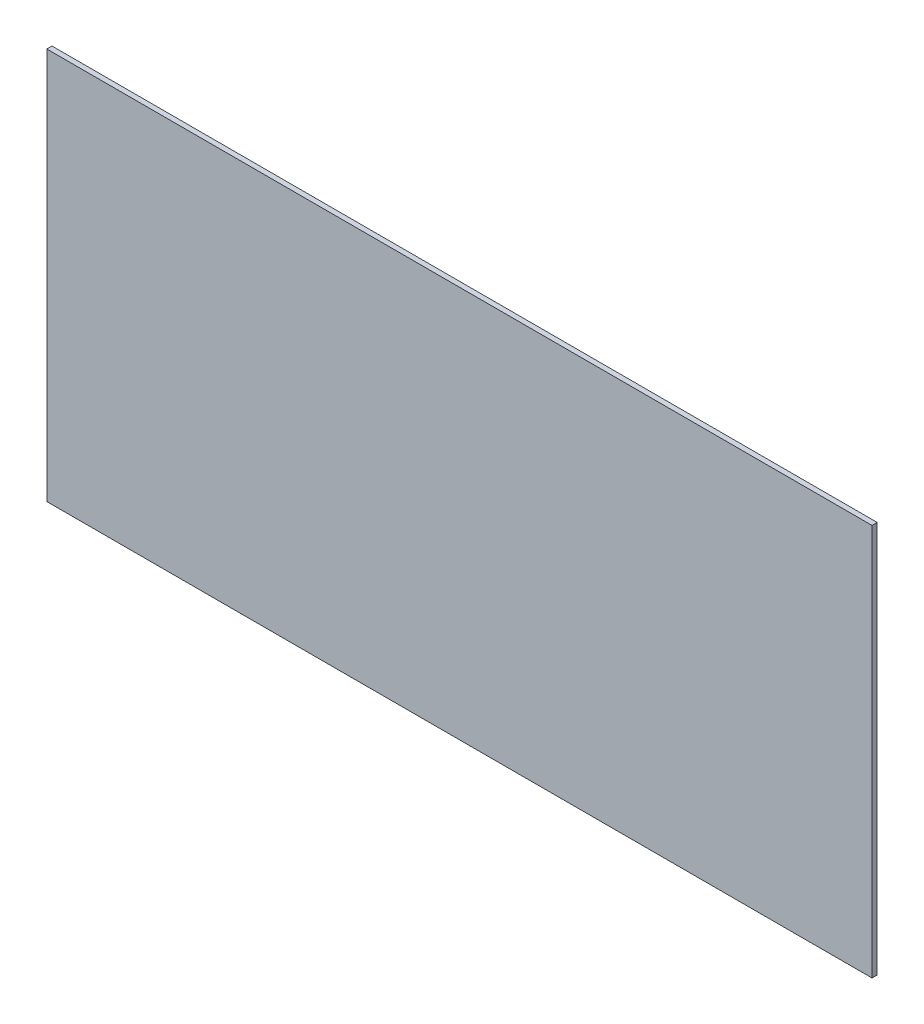
ISO-10303-21;
HEADER;
FILE_DESCRIPTION(('STEP AP214'),'2;1');
FILE_NAME('part.step','',(''),(''),'','','');
FILE_SCHEMA(('AUTOMOTIVE_DESIGN { 1 0 10303 214 1 1 1 1 }'));
ENDSEC;
DATA;
#1=APPLICATION_CONTEXT('core data for automotive mechanical design processes');
#2=APPLICATION_PROTOCOL_DEFINITION('international standard','automotive_design',2000,#1);
#3=PRODUCT_CONTEXT('',#1,'mechanical');
#4=PRODUCT('Part','Part','',(#3));
#5=PRODUCT_RELATED_PRODUCT_CATEGORY('part','',(#4));
#6=PRODUCT_DEFINITION_FORMATION('','',#4);
#7=PRODUCT_DEFINITION_CONTEXT('part definition',#1,'design');
#8=PRODUCT_DEFINITION('design','',#6,#7);
#9=PRODUCT_DEFINITION_SHAPE('','',#8);
#10=(LENGTH_UNIT() NAMED_UNIT(*) SI_UNIT(.MILLI.,.METRE.));
#11=(NAMED_UNIT(*) PLANE_ANGLE_UNIT() SI_UNIT($,.RADIAN.));
#12=(NAMED_UNIT(*) SI_UNIT($,.STERADIAN.) SOLID_ANGLE_UNIT());
#13=UNCERTAINTY_MEASURE_WITH_UNIT(LENGTH_MEASURE(1.E-05),#10,'distance_accuracy_value','');
#14=(GEOMETRIC_REPRESENTATION_CONTEXT(3) GLOBAL_UNCERTAINTY_ASSIGNED_CONTEXT((#13)) GLOBAL_UNIT_ASSIGNED_CONTEXT((#10,
#11,#12)) REPRESENTATION_CONTEXT('',''));
#15=CARTESIAN_POINT('',(0.,0.,0.));
#16=DIRECTION('',(0.,0.,1.));
#17=DIRECTION('',(1.,0.,0.));
#18=AXIS2_PLACEMENT_3D('',#15,#16,#17);
#19=CARTESIAN_POINT('',(0.,0.,1.));
#20=DIRECTION('',(1.,0.,0.));
#21=DIRECTION('',(0.,0.,-1.));
#22=AXIS2_PLACEMENT_3D('',#19,#20,#21);
#23=PLANE('',#22);
#24=DIRECTION('',(0.,-1.,0.));
#25=VECTOR('',#24,1.);
#26=CARTESIAN_POINT('',(0.,0.,0.));
#27=LINE('',#26,#25);
#28=CARTESIAN_POINT('',(0.,76.,0.));
#29=VERTEX_POINT('',#28);
#30=CARTESIAN_POINT('',(0.,0.,0.));
#31=VERTEX_POINT('',#30);
#32=EDGE_CURVE('E98',#29,#31,#27,.T.);
#33=ORIENTED_EDGE('',*,*,#32,.T.);
#34=DIRECTION('',(0.,0.,-1.));
#35=VECTOR('',#34,1.);
#36=CARTESIAN_POINT('',(0.,0.,1.));
#37=LINE('',#36,#35);
#38=CARTESIAN_POINT('',(0.,0.,1.));
#39=VERTEX_POINT('',#38);
#40=EDGE_CURVE('E11',#39,#31,#37,.T.);
#41=ORIENTED_EDGE('',*,*,#40,.F.);
#42=DIRECTION('',(0.,-1.,0.));
#43=VECTOR('',#42,1.);
#44=CARTESIAN_POINT('',(0.,0.,1.));
#45=LINE('',#44,#43);
#46=CARTESIAN_POINT('',(0.,76.,1.));
#47=VERTEX_POINT('',#46);
#48=EDGE_CURVE('E86',#47,#39,#45,.T.);
#49=ORIENTED_EDGE('',*,*,#48,.F.);
#50=DIRECTION('',(0.,0.,-1.));
#51=VECTOR('',#50,1.);
#52=CARTESIAN_POINT('',(0.,76.,1.));
#53=LINE('',#52,#51);
#54=EDGE_CURVE('E94',#47,#29,#53,.T.);
#55=ORIENTED_EDGE('',*,*,#54,.T.);
#56=EDGE_LOOP('',(#33,#41,#49,#55));
#57=FACE_BOUND('',#56,.T.);
#58=ADVANCED_FACE('F35',(#57),#23,.F.);
#59=CARTESIAN_POINT('',(0.,0.,1.));
#60=DIRECTION('',(0.,1.,0.));
#61=DIRECTION('',(0.,0.,1.));
#62=AXIS2_PLACEMENT_3D('',#59,#60,#61);
#63=PLANE('',#62);
#64=DIRECTION('',(1.,0.,0.));
#65=VECTOR('',#64,1.);
#66=CARTESIAN_POINT('',(0.,0.,0.));
#67=LINE('',#66,#65);
#68=CARTESIAN_POINT('',(160.,0.,0.));
#69=VERTEX_POINT('',#68);
#70=EDGE_CURVE('E90',#31,#69,#67,.T.);
#71=ORIENTED_EDGE('',*,*,#70,.T.);
#72=DIRECTION('',(0.,0.,-1.));
#73=VECTOR('',#72,1.);
#74=CARTESIAN_POINT('',(160.,0.,1.));
#75=LINE('',#74,#73);
#76=CARTESIAN_POINT('',(160.,0.,1.));
#77=VERTEX_POINT('',#76);
#78=EDGE_CURVE('E43',#77,#69,#75,.T.);
#79=ORIENTED_EDGE('',*,*,#78,.F.);
#80=DIRECTION('',(1.,0.,0.));
#81=VECTOR('',#80,1.);
#82=CARTESIAN_POINT('',(0.,0.,1.));
#83=LINE('',#82,#81);
#84=EDGE_CURVE('E81',#39,#77,#83,.T.);
#85=ORIENTED_EDGE('',*,*,#84,.F.);
#86=ORIENTED_EDGE('',*,*,#40,.T.);
#87=EDGE_LOOP('',(#71,#79,#85,#86));
#88=FACE_BOUND('',#87,.T.);
#89=ADVANCED_FACE('F89',(#88),#63,.F.);
#90=CARTESIAN_POINT('',(160.,0.,1.));
#91=DIRECTION('',(-1.,0.,0.));
#92=DIRECTION('',(0.,0.,1.));
#93=AXIS2_PLACEMENT_3D('',#90,#91,#92);
#94=PLANE('',#93);
#95=DIRECTION('',(0.,1.,0.));
#96=VECTOR('',#95,1.);
#97=CARTESIAN_POINT('',(160.,0.,0.));
#98=LINE('',#97,#96);
#99=CARTESIAN_POINT('',(160.,76.,0.));
#100=VERTEX_POINT('',#99);
#101=EDGE_CURVE('E68',#69,#100,#98,.T.);
#102=ORIENTED_EDGE('',*,*,#101,.T.);
#103=DIRECTION('',(0.,0.,-1.));
#104=VECTOR('',#103,1.);
#105=CARTESIAN_POINT('',(160.,76.,1.));
#106=LINE('',#105,#104);
#107=CARTESIAN_POINT('',(160.,76.,1.));
#108=VERTEX_POINT('',#107);
#109=EDGE_CURVE('E91',#108,#100,#106,.T.);
#110=ORIENTED_EDGE('',*,*,#109,.F.);
#111=DIRECTION('',(0.,1.,0.));
#112=VECTOR('',#111,1.);
#113=CARTESIAN_POINT('',(160.,0.,1.));
#114=LINE('',#113,#112);
#115=EDGE_CURVE('E84',#77,#108,#114,.T.);
#116=ORIENTED_EDGE('',*,*,#115,.F.);
#117=ORIENTED_EDGE('',*,*,#78,.T.);
#118=EDGE_LOOP('',(#102,#110,#116,#117));
#119=FACE_BOUND('',#118,.T.);
#120=ADVANCED_FACE('F92',(#119),#94,.F.);
#121=CARTESIAN_POINT('',(0.,76.,1.));
#122=DIRECTION('',(0.,-1.,0.));
#123=DIRECTION('',(0.,0.,-1.));
#124=AXIS2_PLACEMENT_3D('',#121,#122,#123);
#125=PLANE('',#124);
#126=DIRECTION('',(-1.,0.,0.));
#127=VECTOR('',#126,1.);
#128=CARTESIAN_POINT('',(0.,76.,0.));
#129=LINE('',#128,#127);
#130=EDGE_CURVE('E74',#100,#29,#129,.T.);
#131=ORIENTED_EDGE('',*,*,#130,.T.);
#132=ORIENTED_EDGE('',*,*,#54,.F.);
#133=DIRECTION('',(-1.,0.,0.));
#134=VECTOR('',#133,1.);
#135=CARTESIAN_POINT('',(0.,76.,1.));
#136=LINE('',#135,#134);
#137=EDGE_CURVE('E51',#108,#47,#136,.T.);
#138=ORIENTED_EDGE('',*,*,#137,.F.);
#139=ORIENTED_EDGE('',*,*,#109,.T.);
#140=EDGE_LOOP('',(#131,#132,#138,#139));
#141=FACE_BOUND('',#140,.T.);
#142=ADVANCED_FACE('F105',(#141),#125,.F.);
#143=CARTESIAN_POINT('',(0.,0.,1.));
#144=DIRECTION('',(0.,0.,-1.));
#145=DIRECTION('',(-1.,0.,0.));
#146=AXIS2_PLACEMENT_3D('',#143,#144,#145);
#147=PLANE('',#146);
#148=ORIENTED_EDGE('',*,*,#48,.T.);
#149=ORIENTED_EDGE('',*,*,#84,.T.);
#150=ORIENTED_EDGE('',*,*,#115,.T.);
#151=ORIENTED_EDGE('',*,*,#137,.T.);
#152=EDGE_LOOP('',(#148,#149,#150,#151));
#153=FACE_BOUND('',#152,.T.);
#154=ADVANCED_FACE('F82',(#153),#147,.F.);
#155=CARTESIAN_POINT('',(0.,0.,0.));
#156=DIRECTION('',(0.,0.,-1.));
#157=DIRECTION('',(-1.,0.,0.));
#158=AXIS2_PLACEMENT_3D('',#155,#156,#157);
#159=PLANE('',#158);
#160=ORIENTED_EDGE('',*,*,#32,.F.);
#161=ORIENTED_EDGE('',*,*,#130,.F.);
#162=ORIENTED_EDGE('',*,*,#101,.F.);
#163=ORIENTED_EDGE('',*,*,#70,.F.);
#164=EDGE_LOOP('',(#160,#161,#162,#163));
#165=FACE_BOUND('',#164,.T.);
#166=ADVANCED_FACE('F108',(#165),#159,.T.);
#167=CLOSED_SHELL('',(#58,#89,#120,#142,#154,#166));
#168=MANIFOLD_SOLID_BREP('B2',#167);
#169=ADVANCED_BREP_SHAPE_REPRESENTATION('',(#18,#168),#14);
#170=SHAPE_DEFINITION_REPRESENTATION(#9,#169);
ENDSEC;
END-ISO-10303-21;
